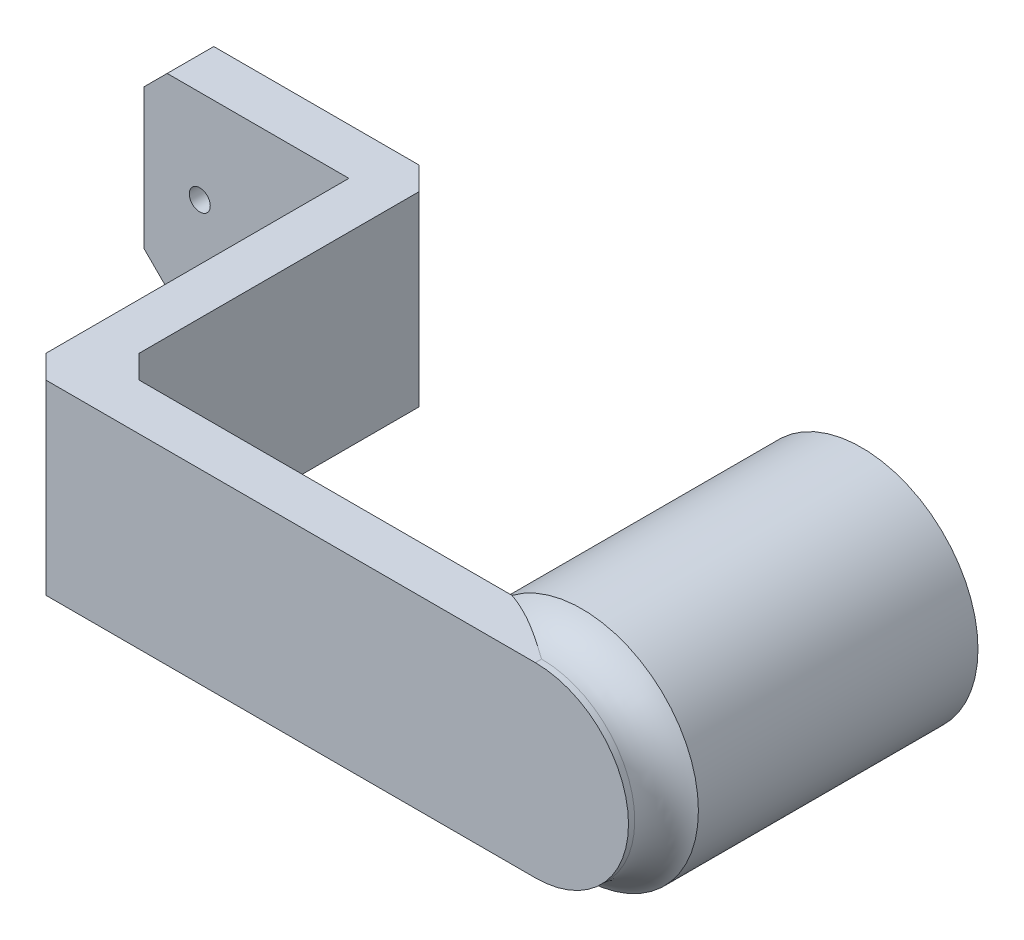
ISO-10303-21;
HEADER;
FILE_DESCRIPTION(('STEP AP214'),'2;1');
FILE_NAME('part.step','',(''),(''),'','','');
FILE_SCHEMA(('AUTOMOTIVE_DESIGN { 1 0 10303 214 1 1 1 1 }'));
ENDSEC;
DATA;
#1=APPLICATION_CONTEXT('core data for automotive mechanical design processes');
#2=APPLICATION_PROTOCOL_DEFINITION('international standard','automotive_design',2000,#1);
#3=PRODUCT_CONTEXT('',#1,'mechanical');
#4=PRODUCT('Part','Part','',(#3));
#5=PRODUCT_RELATED_PRODUCT_CATEGORY('part','',(#4));
#6=PRODUCT_DEFINITION_FORMATION('','',#4);
#7=PRODUCT_DEFINITION_CONTEXT('part definition',#1,'design');
#8=PRODUCT_DEFINITION('design','',#6,#7);
#9=PRODUCT_DEFINITION_SHAPE('','',#8);
#10=(LENGTH_UNIT() NAMED_UNIT(*) SI_UNIT(.MILLI.,.METRE.));
#11=(NAMED_UNIT(*) PLANE_ANGLE_UNIT() SI_UNIT($,.RADIAN.));
#12=(NAMED_UNIT(*) SI_UNIT($,.STERADIAN.) SOLID_ANGLE_UNIT());
#13=UNCERTAINTY_MEASURE_WITH_UNIT(LENGTH_MEASURE(1.E-05),#10,'distance_accuracy_value','');
#14=(GEOMETRIC_REPRESENTATION_CONTEXT(3) GLOBAL_UNCERTAINTY_ASSIGNED_CONTEXT((#13)) GLOBAL_UNIT_ASSIGNED_CONTEXT((#10,
#11,#12)) REPRESENTATION_CONTEXT('',''));
#15=CARTESIAN_POINT('',(0.,0.,0.));
#16=DIRECTION('',(0.,0.,1.));
#17=DIRECTION('',(1.,0.,0.));
#18=AXIS2_PLACEMENT_3D('',#15,#16,#17);
#19=CARTESIAN_POINT('',(0.,40.,-150.));
#20=DIRECTION('',(1.,0.,0.));
#21=DIRECTION('',(0.,0.,1.));
#22=AXIS2_PLACEMENT_3D('',#19,#20,#21);
#23=PLANE('',#22);
#24=DIRECTION('',(0.,-1.,0.));
#25=VECTOR('',#24,1.);
#26=CARTESIAN_POINT('',(0.,40.,-140.));
#27=LINE('',#26,#25);
#28=CARTESIAN_POINT('',(0.,35.,-140.));
#29=VERTEX_POINT('',#28);
#30=CARTESIAN_POINT('',(0.,5.00000000000003,-140.));
#31=VERTEX_POINT('',#30);
#32=EDGE_CURVE('E172',#29,#31,#27,.T.);
#33=ORIENTED_EDGE('',*,*,#32,.F.);
#34=DIRECTION('',(0.,0.,1.));
#35=VECTOR('',#34,1.);
#36=CARTESIAN_POINT('',(0.,35.,-150.));
#37=LINE('',#36,#35);
#38=CARTESIAN_POINT('',(0.,35.,-150.));
#39=VERTEX_POINT('',#38);
#40=EDGE_CURVE('E239',#39,#29,#37,.T.);
#41=ORIENTED_EDGE('',*,*,#40,.F.);
#42=DIRECTION('',(0.,-1.,0.));
#43=VECTOR('',#42,1.);
#44=CARTESIAN_POINT('',(0.,40.,-150.));
#45=LINE('',#44,#43);
#46=CARTESIAN_POINT('',(0.,5.00000000000003,-150.));
#47=VERTEX_POINT('',#46);
#48=EDGE_CURVE('E179',#39,#47,#45,.T.);
#49=ORIENTED_EDGE('',*,*,#48,.T.);
#50=DIRECTION('',(0.,0.,-1.));
#51=VECTOR('',#50,1.);
#52=CARTESIAN_POINT('',(0.,5.00000000000003,-150.));
#53=LINE('',#52,#51);
#54=EDGE_CURVE('E354',#31,#47,#53,.T.);
#55=ORIENTED_EDGE('',*,*,#54,.F.);
#56=EDGE_LOOP('',(#33,#41,#49,#55));
#57=FACE_BOUND('',#56,.T.);
#58=ADVANCED_FACE('F35',(#57),#23,.F.);
#59=CARTESIAN_POINT('',(54.,40.,-150.));
#60=DIRECTION('',(0.,0.,1.));
#61=DIRECTION('',(-1.,0.,0.));
#62=AXIS2_PLACEMENT_3D('',#59,#60,#61);
#63=PLANE('',#62);
#64=CARTESIAN_POINT('',(32.,20.,-150.));
#65=DIRECTION('',(0.,0.,1.));
#66=DIRECTION('',(1.,0.,0.));
#67=AXIS2_PLACEMENT_3D('',#64,#65,#66);
#68=CIRCLE('',#67,2.25);
#69=CARTESIAN_POINT('',(34.25,20.,-150.));
#70=VERTEX_POINT('',#69);
#71=EDGE_CURVE('E344',#70,#70,#68,.T.);
#72=ORIENTED_EDGE('',*,*,#71,.T.);
#73=EDGE_LOOP('',(#72));
#74=FACE_BOUND('',#73,.T.);
#75=CARTESIAN_POINT('',(12.,20.,-150.));
#76=DIRECTION('',(0.,0.,1.));
#77=DIRECTION('',(1.,0.,0.));
#78=AXIS2_PLACEMENT_3D('',#75,#76,#77);
#79=CIRCLE('',#78,2.25);
#80=CARTESIAN_POINT('',(14.25,20.,-150.));
#81=VERTEX_POINT('',#80);
#82=EDGE_CURVE('E348',#81,#81,#79,.T.);
#83=ORIENTED_EDGE('',*,*,#82,.T.);
#84=EDGE_LOOP('',(#83));
#85=FACE_BOUND('',#84,.T.);
#86=ORIENTED_EDGE('',*,*,#48,.F.);
#87=DIRECTION('',(0.707106781186548,0.707106781186548,0.));
#88=VECTOR('',#87,1.);
#89=CARTESIAN_POINT('',(5.00000000000003,40.,-150.));
#90=LINE('',#89,#88);
#91=CARTESIAN_POINT('',(5.00000000000003,40.,-150.));
#92=VERTEX_POINT('',#91);
#93=EDGE_CURVE('E357',#92,#39,#90,.F.);
#94=ORIENTED_EDGE('',*,*,#93,.F.);
#95=DIRECTION('',(1.,0.,0.));
#96=VECTOR('',#95,1.);
#97=CARTESIAN_POINT('',(54.,40.,-150.));
#98=LINE('',#97,#96);
#99=CARTESIAN_POINT('',(49.,40.,-150.));
#100=VERTEX_POINT('',#99);
#101=EDGE_CURVE('E171',#92,#100,#98,.T.);
#102=ORIENTED_EDGE('',*,*,#101,.T.);
#103=DIRECTION('',(0.,1.,0.));
#104=VECTOR('',#103,1.);
#105=CARTESIAN_POINT('',(49.,40.,-150.));
#106=LINE('',#105,#104);
#107=CARTESIAN_POINT('',(49.,0.,-150.));
#108=VERTEX_POINT('',#107);
#109=EDGE_CURVE('E203',#108,#100,#106,.T.);
#110=ORIENTED_EDGE('',*,*,#109,.F.);
#111=DIRECTION('',(1.,0.,0.));
#112=VECTOR('',#111,1.);
#113=CARTESIAN_POINT('',(54.,0.,-150.));
#114=LINE('',#113,#112);
#115=CARTESIAN_POINT('',(5.00000000000003,0.,-150.));
#116=VERTEX_POINT('',#115);
#117=EDGE_CURVE('E156',#116,#108,#114,.T.);
#118=ORIENTED_EDGE('',*,*,#117,.F.);
#119=DIRECTION('',(0.707106781186548,-0.707106781186548,0.));
#120=VECTOR('',#119,1.);
#121=CARTESIAN_POINT('',(0.,5.00000000000003,-150.));
#122=LINE('',#121,#120);
#123=EDGE_CURVE('E359',#47,#116,#122,.T.);
#124=ORIENTED_EDGE('',*,*,#123,.F.);
#125=EDGE_LOOP('',(#86,#94,#102,#110,#118,#124));
#126=FACE_BOUND('',#125,.T.);
#127=ADVANCED_FACE('F263',(#74,#85,#126),#63,.F.);
#128=CARTESIAN_POINT('',(54.,40.,-80.));
#129=DIRECTION('',(-1.,0.,0.));
#130=DIRECTION('',(0.,0.,-1.));
#131=AXIS2_PLACEMENT_3D('',#128,#129,#130);
#132=PLANE('',#131);
#133=DIRECTION('',(0.,0.,1.));
#134=VECTOR('',#133,1.);
#135=CARTESIAN_POINT('',(54.,0.,-80.));
#136=LINE('',#135,#134);
#137=CARTESIAN_POINT('',(54.,0.,-145.));
#138=VERTEX_POINT('',#137);
#139=CARTESIAN_POINT('',(54.,0.,-85.));
#140=VERTEX_POINT('',#139);
#141=EDGE_CURVE('E294',#138,#140,#136,.T.);
#142=ORIENTED_EDGE('',*,*,#141,.F.);
#143=DIRECTION('',(0.,-1.,0.));
#144=VECTOR('',#143,1.);
#145=CARTESIAN_POINT('',(54.,40.,-145.));
#146=LINE('',#145,#144);
#147=CARTESIAN_POINT('',(54.,40.,-145.));
#148=VERTEX_POINT('',#147);
#149=EDGE_CURVE('E185',#148,#138,#146,.T.);
#150=ORIENTED_EDGE('',*,*,#149,.F.);
#151=DIRECTION('',(0.,0.,1.));
#152=VECTOR('',#151,1.);
#153=CARTESIAN_POINT('',(54.,40.,-80.));
#154=LINE('',#153,#152);
#155=CARTESIAN_POINT('',(54.,40.,-85.));
#156=VERTEX_POINT('',#155);
#157=EDGE_CURVE('E313',#148,#156,#154,.T.);
#158=ORIENTED_EDGE('',*,*,#157,.T.);
#159=DIRECTION('',(0.,1.,0.));
#160=VECTOR('',#159,1.);
#161=CARTESIAN_POINT('',(54.,40.,-85.));
#162=LINE('',#161,#160);
#163=EDGE_CURVE('E188',#140,#156,#162,.T.);
#164=ORIENTED_EDGE('',*,*,#163,.F.);
#165=EDGE_LOOP('',(#142,#150,#158,#164));
#166=FACE_BOUND('',#165,.T.);
#167=ADVANCED_FACE('F259',(#166),#132,.F.);
#168=CARTESIAN_POINT('',(154.,40.,-80.));
#169=DIRECTION('',(0.,0.,1.));
#170=DIRECTION('',(-1.,0.,0.));
#171=AXIS2_PLACEMENT_3D('',#168,#169,#170);
#172=PLANE('',#171);
#173=CARTESIAN_POINT('',(154.,20.,-80.));
#174=DIRECTION('',(0.,0.,1.));
#175=DIRECTION('',(1.,0.,0.));
#176=AXIS2_PLACEMENT_3D('',#173,#174,#175);
#177=CIRCLE('',#176,25.);
#178=CARTESIAN_POINT('',(139.,40.,-80.));
#179=VERTEX_POINT('',#178);
#180=CARTESIAN_POINT('',(139.,0.,-80.));
#181=VERTEX_POINT('',#180);
#182=EDGE_CURVE('E301',#179,#181,#177,.T.);
#183=ORIENTED_EDGE('',*,*,#182,.T.);
#184=DIRECTION('',(1.,0.,0.));
#185=VECTOR('',#184,1.);
#186=CARTESIAN_POINT('',(154.,0.,-80.));
#187=LINE('',#186,#185);
#188=CARTESIAN_POINT('',(59.,0.,-80.));
#189=VERTEX_POINT('',#188);
#190=EDGE_CURVE('E146',#189,#181,#187,.T.);
#191=ORIENTED_EDGE('',*,*,#190,.F.);
#192=DIRECTION('',(0.,-1.,0.));
#193=VECTOR('',#192,1.);
#194=CARTESIAN_POINT('',(59.,0.,-80.));
#195=LINE('',#194,#193);
#196=CARTESIAN_POINT('',(59.,40.,-80.));
#197=VERTEX_POINT('',#196);
#198=EDGE_CURVE('E182',#197,#189,#195,.T.);
#199=ORIENTED_EDGE('',*,*,#198,.F.);
#200=DIRECTION('',(1.,0.,0.));
#201=VECTOR('',#200,1.);
#202=CARTESIAN_POINT('',(154.,40.,-80.));
#203=LINE('',#202,#201);
#204=EDGE_CURVE('E303',#197,#179,#203,.T.);
#205=ORIENTED_EDGE('',*,*,#204,.T.);
#206=EDGE_LOOP('',(#183,#191,#199,#205));
#207=FACE_BOUND('',#206,.T.);
#208=ADVANCED_FACE('F256',(#207),#172,.F.);
#209=CARTESIAN_POINT('',(44.,40.,-70.));
#210=DIRECTION('',(0.,0.,-1.));
#211=DIRECTION('',(1.,0.,0.));
#212=AXIS2_PLACEMENT_3D('',#209,#210,#211);
#213=PLANE('',#212);
#214=DIRECTION('',(-1.,0.,0.));
#215=VECTOR('',#214,1.);
#216=CARTESIAN_POINT('',(44.,40.,-70.));
#217=LINE('',#216,#215);
#218=CARTESIAN_POINT('',(154.,40.,-70.));
#219=VERTEX_POINT('',#218);
#220=CARTESIAN_POINT('',(49.,40.,-70.));
#221=VERTEX_POINT('',#220);
#222=EDGE_CURVE('E287',#219,#221,#217,.T.);
#223=ORIENTED_EDGE('',*,*,#222,.T.);
#224=DIRECTION('',(0.,1.,0.));
#225=VECTOR('',#224,1.);
#226=CARTESIAN_POINT('',(49.,40.,-70.));
#227=LINE('',#226,#225);
#228=CARTESIAN_POINT('',(49.,0.,-70.));
#229=VERTEX_POINT('',#228);
#230=EDGE_CURVE('E161',#229,#221,#227,.T.);
#231=ORIENTED_EDGE('',*,*,#230,.F.);
#232=DIRECTION('',(-1.,0.,0.));
#233=VECTOR('',#232,1.);
#234=CARTESIAN_POINT('',(44.,0.,-70.));
#235=LINE('',#234,#233);
#236=CARTESIAN_POINT('',(154.,0.,-70.));
#237=VERTEX_POINT('',#236);
#238=EDGE_CURVE('E140',#237,#229,#235,.T.);
#239=ORIENTED_EDGE('',*,*,#238,.F.);
#240=CARTESIAN_POINT('',(154.,20.,-70.));
#241=DIRECTION('',(0.,0.,1.));
#242=DIRECTION('',(1.,0.,0.));
#243=AXIS2_PLACEMENT_3D('',#240,#241,#242);
#244=CIRCLE('',#243,20.);
#245=EDGE_CURVE('E149',#237,#219,#244,.T.);
#246=ORIENTED_EDGE('',*,*,#245,.T.);
#247=EDGE_LOOP('',(#223,#231,#239,#246));
#248=FACE_BOUND('',#247,.T.);
#249=ADVANCED_FACE('F159',(#248),#213,.F.);
#250=CARTESIAN_POINT('',(44.,40.,-140.));
#251=DIRECTION('',(1.,0.,0.));
#252=DIRECTION('',(0.,0.,1.));
#253=AXIS2_PLACEMENT_3D('',#250,#251,#252);
#254=PLANE('',#253);
#255=DIRECTION('',(0.,0.,-1.));
#256=VECTOR('',#255,1.);
#257=CARTESIAN_POINT('',(44.,40.,-140.));
#258=LINE('',#257,#256);
#259=CARTESIAN_POINT('',(44.,40.,-75.));
#260=VERTEX_POINT('',#259);
#261=CARTESIAN_POINT('',(44.,40.,-140.));
#262=VERTEX_POINT('',#261);
#263=EDGE_CURVE('E284',#260,#262,#258,.T.);
#264=ORIENTED_EDGE('',*,*,#263,.T.);
#265=DIRECTION('',(0.,-1.,0.));
#266=VECTOR('',#265,1.);
#267=CARTESIAN_POINT('',(44.,40.,-140.));
#268=LINE('',#267,#266);
#269=CARTESIAN_POINT('',(44.,0.,-140.));
#270=VERTEX_POINT('',#269);
#271=EDGE_CURVE('E175',#262,#270,#268,.T.);
#272=ORIENTED_EDGE('',*,*,#271,.T.);
#273=DIRECTION('',(0.,0.,-1.));
#274=VECTOR('',#273,1.);
#275=CARTESIAN_POINT('',(44.,0.,-140.));
#276=LINE('',#275,#274);
#277=CARTESIAN_POINT('',(44.,0.,-75.));
#278=VERTEX_POINT('',#277);
#279=EDGE_CURVE('E162',#278,#270,#276,.T.);
#280=ORIENTED_EDGE('',*,*,#279,.F.);
#281=DIRECTION('',(0.,-1.,0.));
#282=VECTOR('',#281,1.);
#283=CARTESIAN_POINT('',(44.,40.,-75.));
#284=LINE('',#283,#282);
#285=EDGE_CURVE('E191',#260,#278,#284,.T.);
#286=ORIENTED_EDGE('',*,*,#285,.F.);
#287=EDGE_LOOP('',(#264,#272,#280,#286));
#288=FACE_BOUND('',#287,.T.);
#289=ADVANCED_FACE('F249',(#288),#254,.F.);
#290=CARTESIAN_POINT('',(0.,40.,-140.));
#291=DIRECTION('',(0.,0.,-1.));
#292=DIRECTION('',(1.,0.,0.));
#293=AXIS2_PLACEMENT_3D('',#290,#291,#292);
#294=PLANE('',#293);
#295=CARTESIAN_POINT('',(32.,20.,-140.));
#296=DIRECTION('',(0.,0.,1.));
#297=DIRECTION('',(1.,0.,0.));
#298=AXIS2_PLACEMENT_3D('',#295,#296,#297);
#299=CIRCLE('',#298,2.25);
#300=CARTESIAN_POINT('',(34.25,20.,-140.));
#301=VERTEX_POINT('',#300);
#302=EDGE_CURVE('E347',#301,#301,#299,.T.);
#303=ORIENTED_EDGE('',*,*,#302,.F.);
#304=EDGE_LOOP('',(#303));
#305=FACE_BOUND('',#304,.T.);
#306=CARTESIAN_POINT('',(12.,20.,-140.));
#307=DIRECTION('',(0.,0.,1.));
#308=DIRECTION('',(1.,0.,0.));
#309=AXIS2_PLACEMENT_3D('',#306,#307,#308);
#310=CIRCLE('',#309,2.25);
#311=CARTESIAN_POINT('',(14.25,20.,-140.));
#312=VERTEX_POINT('',#311);
#313=EDGE_CURVE('E240',#312,#312,#310,.T.);
#314=ORIENTED_EDGE('',*,*,#313,.F.);
#315=EDGE_LOOP('',(#314));
#316=FACE_BOUND('',#315,.T.);
#317=DIRECTION('',(-1.,0.,0.));
#318=VECTOR('',#317,1.);
#319=CARTESIAN_POINT('',(0.,0.,-140.));
#320=LINE('',#319,#318);
#321=CARTESIAN_POINT('',(5.00000000000003,0.,-140.));
#322=VERTEX_POINT('',#321);
#323=EDGE_CURVE('E165',#270,#322,#320,.T.);
#324=ORIENTED_EDGE('',*,*,#323,.F.);
#325=ORIENTED_EDGE('',*,*,#271,.F.);
#326=DIRECTION('',(-1.,0.,0.));
#327=VECTOR('',#326,1.);
#328=CARTESIAN_POINT('',(0.,40.,-140.));
#329=LINE('',#328,#327);
#330=CARTESIAN_POINT('',(5.00000000000003,40.,-140.));
#331=VERTEX_POINT('',#330);
#332=EDGE_CURVE('E176',#262,#331,#329,.T.);
#333=ORIENTED_EDGE('',*,*,#332,.T.);
#334=DIRECTION('',(-0.707106781186548,-0.707106781186548,0.));
#335=VECTOR('',#334,1.);
#336=CARTESIAN_POINT('',(5.00000000000003,40.,-140.));
#337=LINE('',#336,#335);
#338=EDGE_CURVE('E362',#29,#331,#337,.F.);
#339=ORIENTED_EDGE('',*,*,#338,.F.);
#340=ORIENTED_EDGE('',*,*,#32,.T.);
#341=DIRECTION('',(-0.707106781186548,0.707106781186548,0.));
#342=VECTOR('',#341,1.);
#343=CARTESIAN_POINT('',(0.,5.00000000000003,-140.));
#344=LINE('',#343,#342);
#345=EDGE_CURVE('E43',#322,#31,#344,.T.);
#346=ORIENTED_EDGE('',*,*,#345,.F.);
#347=EDGE_LOOP('',(#324,#325,#333,#339,#340,#346));
#348=FACE_BOUND('',#347,.T.);
#349=ADVANCED_FACE('F246',(#305,#316,#348),#294,.F.);
#350=CARTESIAN_POINT('',(0.,40.,-140.));
#351=DIRECTION('',(0.,-1.,0.));
#352=DIRECTION('',(0.,0.,1.));
#353=AXIS2_PLACEMENT_3D('',#350,#351,#352);
#354=PLANE('',#353);
#355=ORIENTED_EDGE('',*,*,#332,.F.);
#356=ORIENTED_EDGE('',*,*,#263,.F.);
#357=DIRECTION('',(0.707106781186549,0.,0.707106781186546));
#358=VECTOR('',#357,1.);
#359=CARTESIAN_POINT('',(44.,40.,-75.));
#360=LINE('',#359,#358);
#361=EDGE_CURVE('E201',#221,#260,#360,.F.);
#362=ORIENTED_EDGE('',*,*,#361,.F.);
#363=ORIENTED_EDGE('',*,*,#222,.F.);
#364=DIRECTION('',(0.,0.,1.));
#365=VECTOR('',#364,1.);
#366=CARTESIAN_POINT('',(154.,40.,-70.));
#367=LINE('',#366,#365);
#368=CARTESIAN_POINT('',(154.,40.,-71.3397459621556));
#369=VERTEX_POINT('',#368);
#370=EDGE_CURVE('E152',#369,#219,#367,.T.);
#371=ORIENTED_EDGE('',*,*,#370,.F.);
#372=CARTESIAN_POINT('',(139.,40.,-80.));
#373=CARTESIAN_POINT('',(139.344380062185,40.,-79.8806979557586));
#374=CARTESIAN_POINT('',(139.686474280359,40.,-79.7549683316145));
#375=CARTESIAN_POINT('',(140.36602812136,40.,-79.4917614514274));
#376=CARTESIAN_POINT('',(140.703488801616,40.,-79.3542869292294));
#377=CARTESIAN_POINT('',(141.708078563995,40.,-78.9262386783618));
#378=CARTESIAN_POINT('',(142.368427872025,40.,-78.619683082067));
#379=CARTESIAN_POINT('',(143.668003876174,40.,-77.9737592636381));
#380=CARTESIAN_POINT('',(144.307328912088,40.,-77.6345864235033));
#381=CARTESIAN_POINT('',(145.570859919965,40.,-76.9287679770658));
#382=CARTESIAN_POINT('',(146.195059993496,40.,-76.5621118739522));
#383=CARTESIAN_POINT('',(148.041369538049,40.,-75.4348228494598));
#384=CARTESIAN_POINT('',(149.244366769268,39.9999999999999,-74.6431296116976));
#385=CARTESIAN_POINT('',(151.623917903583,40.0000000000001,-73.0197177428263));
#386=CARTESIAN_POINT('',(152.800443687328,40.0000000000003,-72.1879592483504));
#387=CARTESIAN_POINT('',(153.984603991688,40.,-71.350632583132));
#388=CARTESIAN_POINT('',(153.992301995271,40.,-71.3451892725832));
#389=CARTESIAN_POINT('',(154.,40.,-71.3397459621556));
#390=B_SPLINE_CURVE_WITH_KNOTS('',3,(#372,#373,#374,#375,#376,#377,#378,#379,#380,#381,#382,
#383,#384,#385,#386,#387,#388,#389),.UNSPECIFIED.,.F.,.F.,(4,2,2,2,2,2,2,2,4),(0.,
1.09322367181625,2.18619356506847,4.36891881820523,6.53929936117406,8.71051311348667,
13.0287211255434,17.3513181002292,17.3796023714769),.UNSPECIFIED.);
#391=EDGE_CURVE('E210',#179,#369,#390,.T.);
#392=ORIENTED_EDGE('',*,*,#391,.F.);
#393=ORIENTED_EDGE('',*,*,#204,.F.);
#394=DIRECTION('',(-0.707106781186551,0.,-0.707106781186544));
#395=VECTOR('',#394,1.);
#396=CARTESIAN_POINT('',(-0.5000000000003,40.,-139.5));
#397=LINE('',#396,#395);
#398=EDGE_CURVE('E208',#156,#197,#397,.F.);
#399=ORIENTED_EDGE('',*,*,#398,.F.);
#400=ORIENTED_EDGE('',*,*,#157,.F.);
#401=DIRECTION('',(-0.707106781186547,0.,-0.707106781186548));
#402=VECTOR('',#401,1.);
#403=CARTESIAN_POINT('',(54.,40.,-145.));
#404=LINE('',#403,#402);
#405=EDGE_CURVE('E199',#100,#148,#404,.F.);
#406=ORIENTED_EDGE('',*,*,#405,.F.);
#407=ORIENTED_EDGE('',*,*,#101,.F.);
#408=DIRECTION('',(0.,0.,-1.));
#409=VECTOR('',#408,1.);
#410=CARTESIAN_POINT('',(5.00000000000003,40.,-140.));
#411=LINE('',#410,#409);
#412=EDGE_CURVE('E11',#331,#92,#411,.T.);
#413=ORIENTED_EDGE('',*,*,#412,.F.);
#414=EDGE_LOOP('',(#355,#356,#362,#363,#371,#392,#393,#399,#400,#406,#407,#413));
#415=FACE_BOUND('',#414,.T.);
#416=ADVANCED_FACE('F220',(#415),#354,.F.);
#417=CARTESIAN_POINT('',(0.,0.,-140.));
#418=DIRECTION('',(0.,-1.,0.));
#419=DIRECTION('',(0.,0.,1.));
#420=AXIS2_PLACEMENT_3D('',#417,#418,#419);
#421=PLANE('',#420);
#422=ORIENTED_EDGE('',*,*,#117,.T.);
#423=DIRECTION('',(0.707106781186547,0.,0.707106781186548));
#424=VECTOR('',#423,1.);
#425=CARTESIAN_POINT('',(29.5,0.,-169.5));
#426=LINE('',#425,#424);
#427=EDGE_CURVE('E194',#138,#108,#426,.F.);
#428=ORIENTED_EDGE('',*,*,#427,.F.);
#429=ORIENTED_EDGE('',*,*,#141,.T.);
#430=DIRECTION('',(0.707106781186551,0.,0.707106781186544));
#431=VECTOR('',#430,1.);
#432=CARTESIAN_POINT('',(59.,0.,-80.));
#433=LINE('',#432,#431);
#434=EDGE_CURVE('E206',#189,#140,#433,.F.);
#435=ORIENTED_EDGE('',*,*,#434,.F.);
#436=ORIENTED_EDGE('',*,*,#190,.T.);
#437=CARTESIAN_POINT('',(139.,0.,-80.));
#438=CARTESIAN_POINT('',(139.344380062185,0.,-79.8806979557587));
#439=CARTESIAN_POINT('',(139.686474280359,0.,-79.7549683316147));
#440=CARTESIAN_POINT('',(140.366028121359,0.,-79.4917614514278));
#441=CARTESIAN_POINT('',(140.703488801615,0.,-79.3542869292299));
#442=CARTESIAN_POINT('',(141.708078563993,0.,-78.9262386783626));
#443=CARTESIAN_POINT('',(142.368427872023,0.,-78.619683082068));
#444=CARTESIAN_POINT('',(143.668003876173,0.,-77.973759263639));
#445=CARTESIAN_POINT('',(144.307328912086,0.,-77.6345864235037));
#446=CARTESIAN_POINT('',(145.570859919966,0.,-76.9287679770659));
#447=CARTESIAN_POINT('',(146.195059993497,0.,-76.5621118739522));
#448=CARTESIAN_POINT('',(148.04136953805,0.,-75.4348228494583));
#449=CARTESIAN_POINT('',(149.244366769266,0.,-74.6431296116927));
#450=CARTESIAN_POINT('',(151.623917903586,0.,-73.0197177428301));
#451=CARTESIAN_POINT('',(152.80044368734,-2.10927082746033E-13,-72.1879592483663));
#452=CARTESIAN_POINT('',(153.984603991688,0.,-71.3506325831323));
#453=CARTESIAN_POINT('',(153.992301995271,0.,-71.3451892725834));
#454=CARTESIAN_POINT('',(154.,0.,-71.3397459621556));
#455=B_SPLINE_CURVE_WITH_KNOTS('',3,(#437,#438,#439,#440,#441,#442,#443,#444,#445,#446,#447,
#448,#449,#450,#451,#452,#453,#454),.UNSPECIFIED.,.F.,.F.,(4,2,2,2,2,2,2,2,4),(0.,
1.09322367181548,2.18619356506696,4.36891881820259,6.53929936117358,8.71051311348813,
13.0287211255445,17.3513181002292,17.3796023714769),.UNSPECIFIED.);
#456=CARTESIAN_POINT('',(154.,0.,-71.3397459621556));
#457=VERTEX_POINT('',#456);
#458=EDGE_CURVE('E144',#457,#181,#455,.F.);
#459=ORIENTED_EDGE('',*,*,#458,.F.);
#460=DIRECTION('',(0.,0.,1.));
#461=VECTOR('',#460,1.);
#462=CARTESIAN_POINT('',(154.,0.,-70.));
#463=LINE('',#462,#461);
#464=EDGE_CURVE('E135',#457,#237,#463,.T.);
#465=ORIENTED_EDGE('',*,*,#464,.T.);
#466=ORIENTED_EDGE('',*,*,#238,.T.);
#467=DIRECTION('',(-0.707106781186549,0.,-0.707106781186546));
#468=VECTOR('',#467,1.);
#469=CARTESIAN_POINT('',(-10.5000000000001,0.,-129.5));
#470=LINE('',#469,#468);
#471=EDGE_CURVE('E196',#278,#229,#470,.F.);
#472=ORIENTED_EDGE('',*,*,#471,.F.);
#473=ORIENTED_EDGE('',*,*,#279,.T.);
#474=ORIENTED_EDGE('',*,*,#323,.T.);
#475=DIRECTION('',(0.,0.,1.));
#476=VECTOR('',#475,1.);
#477=CARTESIAN_POINT('',(5.00000000000003,0.,-140.));
#478=LINE('',#477,#476);
#479=EDGE_CURVE('E56',#116,#322,#478,.T.);
#480=ORIENTED_EDGE('',*,*,#479,.F.);
#481=EDGE_LOOP('',(#422,#428,#429,#435,#436,#459,#465,#466,#472,#473,#474,#480));
#482=FACE_BOUND('',#481,.T.);
#483=ADVANCED_FACE('F138',(#482),#421,.T.);
#484=CARTESIAN_POINT('',(59.,40.,-80.));
#485=DIRECTION('',(0.707106781186543,0.,-0.707106781186551));
#486=DIRECTION('',(0.,1.,0.));
#487=AXIS2_PLACEMENT_3D('',#484,#485,#486);
#488=PLANE('',#487);
#489=ORIENTED_EDGE('',*,*,#398,.T.);
#490=ORIENTED_EDGE('',*,*,#198,.T.);
#491=ORIENTED_EDGE('',*,*,#434,.T.);
#492=ORIENTED_EDGE('',*,*,#163,.T.);
#493=EDGE_LOOP('',(#489,#490,#491,#492));
#494=FACE_BOUND('',#493,.T.);
#495=ADVANCED_FACE('F245',(#494),#488,.T.);
#496=CARTESIAN_POINT('',(44.,40.,-75.));
#497=DIRECTION('',(0.707106781186545,0.,-0.707106781186549));
#498=DIRECTION('',(0.,-1.,0.));
#499=AXIS2_PLACEMENT_3D('',#496,#497,#498);
#500=PLANE('',#499);
#501=ORIENTED_EDGE('',*,*,#361,.T.);
#502=ORIENTED_EDGE('',*,*,#285,.T.);
#503=ORIENTED_EDGE('',*,*,#471,.T.);
#504=ORIENTED_EDGE('',*,*,#230,.T.);
#505=EDGE_LOOP('',(#501,#502,#503,#504));
#506=FACE_BOUND('',#505,.T.);
#507=ADVANCED_FACE('F272',(#506),#500,.F.);
#508=CARTESIAN_POINT('',(54.,40.,-145.));
#509=DIRECTION('',(-0.707106781186548,0.,0.707106781186547));
#510=DIRECTION('',(0.,-1.,0.));
#511=AXIS2_PLACEMENT_3D('',#508,#509,#510);
#512=PLANE('',#511);
#513=ORIENTED_EDGE('',*,*,#405,.T.);
#514=ORIENTED_EDGE('',*,*,#149,.T.);
#515=ORIENTED_EDGE('',*,*,#427,.T.);
#516=ORIENTED_EDGE('',*,*,#109,.T.);
#517=EDGE_LOOP('',(#513,#514,#515,#516));
#518=FACE_BOUND('',#517,.T.);
#519=ADVANCED_FACE('F231',(#518),#512,.F.);
#520=CARTESIAN_POINT('',(154.,20.,-70.));
#521=DIRECTION('',(0.,0.,-1.));
#522=DIRECTION('',(1.,0.,0.));
#523=AXIS2_PLACEMENT_3D('',#520,#521,#522);
#524=CYLINDRICAL_SURFACE('',#523,20.);
#525=ORIENTED_EDGE('',*,*,#370,.T.);
#526=ORIENTED_EDGE('',*,*,#245,.F.);
#527=ORIENTED_EDGE('',*,*,#464,.F.);
#528=CARTESIAN_POINT('',(154.,20.,-71.3397459621556));
#529=DIRECTION('',(0.,0.,1.));
#530=DIRECTION('',(1.,0.,0.));
#531=AXIS2_PLACEMENT_3D('',#528,#529,#530);
#532=CIRCLE('',#531,20.);
#533=EDGE_CURVE('E218',#369,#457,#532,.F.);
#534=ORIENTED_EDGE('',*,*,#533,.F.);
#535=EDGE_LOOP('',(#525,#526,#527,#534));
#536=FACE_BOUND('',#535,.T.);
#537=ADVANCED_FACE('F150',(#536),#524,.T.);
#538=CARTESIAN_POINT('',(154.,20.,-140.));
#539=DIRECTION('',(0.,0.,1.));
#540=DIRECTION('',(-1.,0.,0.));
#541=AXIS2_PLACEMENT_3D('',#538,#539,#540);
#542=CYLINDRICAL_SURFACE('',#541,25.);
#543=CARTESIAN_POINT('',(154.,20.,-140.));
#544=DIRECTION('',(0.,0.,1.));
#545=DIRECTION('',(1.,0.,0.));
#546=AXIS2_PLACEMENT_3D('',#543,#544,#545);
#547=CIRCLE('',#546,25.);
#548=CARTESIAN_POINT('',(179.,20.,-140.));
#549=VERTEX_POINT('',#548);
#550=EDGE_CURVE('E157',#549,#549,#547,.T.);
#551=ORIENTED_EDGE('',*,*,#550,.T.);
#552=EDGE_LOOP('',(#551));
#553=FACE_BOUND('',#552,.T.);
#554=ORIENTED_EDGE('',*,*,#182,.F.);
#555=EDGE_CURVE('E305',#181,#179,#177,.T.);
#556=ORIENTED_EDGE('',*,*,#555,.F.);
#557=EDGE_LOOP('',(#554,#556));
#558=FACE_BOUND('',#557,.T.);
#559=ADVANCED_FACE('F321',(#553,#558),#542,.T.);
#560=CARTESIAN_POINT('',(154.,20.,-140.));
#561=DIRECTION('',(0.,0.,-1.));
#562=DIRECTION('',(1.,0.,0.));
#563=AXIS2_PLACEMENT_3D('',#560,#561,#562);
#564=PLANE('',#563);
#565=ORIENTED_EDGE('',*,*,#550,.F.);
#566=EDGE_LOOP('',(#565));
#567=FACE_BOUND('',#566,.T.);
#568=ADVANCED_FACE('F229',(#567),#564,.T.);
#569=CARTESIAN_POINT('',(154.,20.,-71.3397459621556));
#570=DIRECTION('',(0.,0.,-1.));
#571=DIRECTION('',(1.,0.,0.));
#572=AXIS2_PLACEMENT_3D('',#569,#570,#571);
#573=TOROIDAL_SURFACE('',#572,30.,10.);
#574=ORIENTED_EDGE('',*,*,#458,.T.);
#575=ORIENTED_EDGE('',*,*,#555,.T.);
#576=ORIENTED_EDGE('',*,*,#391,.T.);
#577=ORIENTED_EDGE('',*,*,#533,.T.);
#578=EDGE_LOOP('',(#574,#575,#576,#577));
#579=FACE_BOUND('',#578,.T.);
#580=ADVANCED_FACE('F224',(#579),#573,.F.);
#581=CARTESIAN_POINT('',(12.,20.,-90.));
#582=DIRECTION('',(0.,0.,-1.));
#583=DIRECTION('',(1.,0.,0.));
#584=AXIS2_PLACEMENT_3D('',#581,#582,#583);
#585=CYLINDRICAL_SURFACE('',#584,2.25);
#586=ORIENTED_EDGE('',*,*,#82,.F.);
#587=EDGE_LOOP('',(#586));
#588=FACE_BOUND('',#587,.T.);
#589=ORIENTED_EDGE('',*,*,#313,.T.);
#590=EDGE_LOOP('',(#589));
#591=FACE_BOUND('',#590,.T.);
#592=ADVANCED_FACE('F228',(#588,#591),#585,.F.);
#593=CARTESIAN_POINT('',(32.,20.,-90.));
#594=DIRECTION('',(0.,0.,-1.));
#595=DIRECTION('',(1.,0.,0.));
#596=AXIS2_PLACEMENT_3D('',#593,#594,#595);
#597=CYLINDRICAL_SURFACE('',#596,2.25);
#598=ORIENTED_EDGE('',*,*,#71,.F.);
#599=EDGE_LOOP('',(#598));
#600=FACE_BOUND('',#599,.T.);
#601=ORIENTED_EDGE('',*,*,#302,.T.);
#602=EDGE_LOOP('',(#601));
#603=FACE_BOUND('',#602,.T.);
#604=ADVANCED_FACE('F334',(#600,#603),#597,.F.);
#605=CARTESIAN_POINT('',(0.,5.00000000000003,-150.));
#606=DIRECTION('',(-0.707106781186547,-0.707106781186547,0.));
#607=DIRECTION('',(0.,0.,1.));
#608=AXIS2_PLACEMENT_3D('',#605,#606,#607);
#609=PLANE('',#608);
#610=ORIENTED_EDGE('',*,*,#345,.T.);
#611=ORIENTED_EDGE('',*,*,#54,.T.);
#612=ORIENTED_EDGE('',*,*,#123,.T.);
#613=ORIENTED_EDGE('',*,*,#479,.T.);
#614=EDGE_LOOP('',(#610,#611,#612,#613));
#615=FACE_BOUND('',#614,.T.);
#616=ADVANCED_FACE('F233',(#615),#609,.T.);
#617=CARTESIAN_POINT('',(5.00000000000003,40.,-140.));
#618=DIRECTION('',(0.707106781186547,-0.707106781186547,0.));
#619=DIRECTION('',(0.,0.,-1.));
#620=AXIS2_PLACEMENT_3D('',#617,#618,#619);
#621=PLANE('',#620);
#622=ORIENTED_EDGE('',*,*,#338,.T.);
#623=ORIENTED_EDGE('',*,*,#412,.T.);
#624=ORIENTED_EDGE('',*,*,#93,.T.);
#625=ORIENTED_EDGE('',*,*,#40,.T.);
#626=EDGE_LOOP('',(#622,#623,#624,#625));
#627=FACE_BOUND('',#626,.T.);
#628=ADVANCED_FACE('F37',(#627),#621,.F.);
#629=CLOSED_SHELL('',(#58,#127,#167,#208,#249,#289,#349,#416,#483,#495,#507,#519,#537,#559,#568,
#580,#592,#604,#616,#628));
#630=MANIFOLD_SOLID_BREP('B2',#629);
#631=ADVANCED_BREP_SHAPE_REPRESENTATION('',(#18,#630),#14);
#632=SHAPE_DEFINITION_REPRESENTATION(#9,#631);
ENDSEC;
END-ISO-10303-21;
